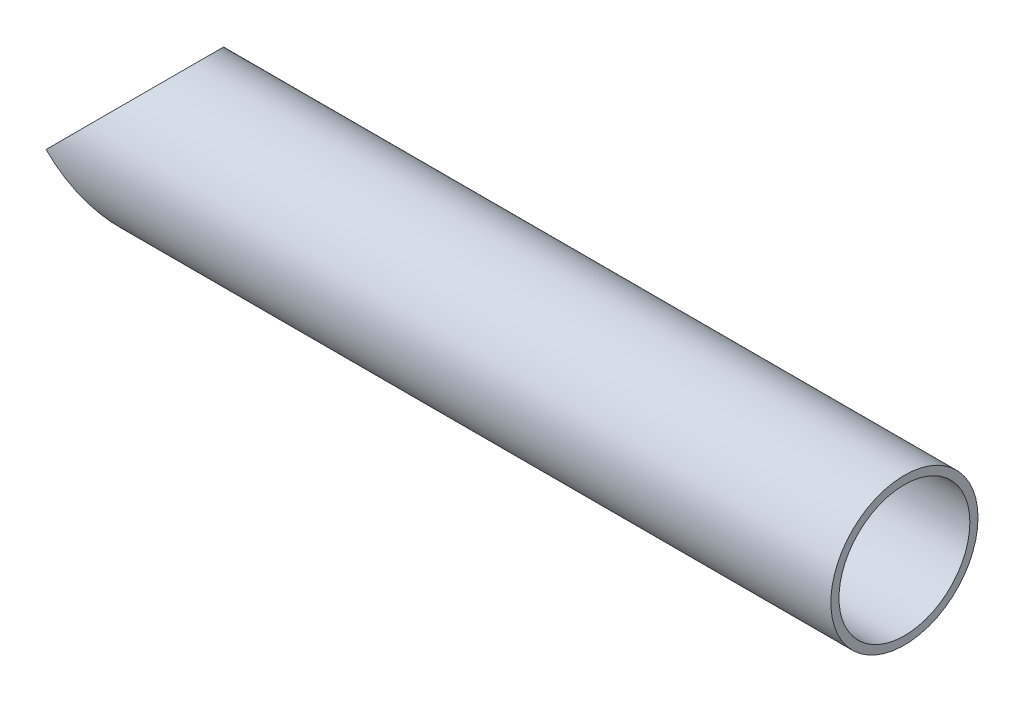
ISO-10303-21;
HEADER;
FILE_DESCRIPTION(('STEP AP214'),'2;1');
FILE_NAME('part.step','',(''),(''),'','','');
FILE_SCHEMA(('AUTOMOTIVE_DESIGN { 1 0 10303 214 1 1 1 1 }'));
ENDSEC;
DATA;
#1=APPLICATION_CONTEXT('core data for automotive mechanical design processes');
#2=APPLICATION_PROTOCOL_DEFINITION('international standard','automotive_design',2000,#1);
#3=PRODUCT_CONTEXT('',#1,'mechanical');
#4=PRODUCT('Part','Part','',(#3));
#5=PRODUCT_RELATED_PRODUCT_CATEGORY('part','',(#4));
#6=PRODUCT_DEFINITION_FORMATION('','',#4);
#7=PRODUCT_DEFINITION_CONTEXT('part definition',#1,'design');
#8=PRODUCT_DEFINITION('design','',#6,#7);
#9=PRODUCT_DEFINITION_SHAPE('','',#8);
#10=(LENGTH_UNIT() NAMED_UNIT(*) SI_UNIT(.MILLI.,.METRE.));
#11=(NAMED_UNIT(*) PLANE_ANGLE_UNIT() SI_UNIT($,.RADIAN.));
#12=(NAMED_UNIT(*) SI_UNIT($,.STERADIAN.) SOLID_ANGLE_UNIT());
#13=UNCERTAINTY_MEASURE_WITH_UNIT(LENGTH_MEASURE(1.E-05),#10,'distance_accuracy_value','');
#14=(GEOMETRIC_REPRESENTATION_CONTEXT(3) GLOBAL_UNCERTAINTY_ASSIGNED_CONTEXT((#13)) GLOBAL_UNIT_ASSIGNED_CONTEXT((#10,
#11,#12)) REPRESENTATION_CONTEXT('',''));
#15=CARTESIAN_POINT('',(0.,0.,0.));
#16=DIRECTION('',(0.,0.,1.));
#17=DIRECTION('',(1.,0.,0.));
#18=AXIS2_PLACEMENT_3D('',#15,#16,#17);
#19=CARTESIAN_POINT('',(0.,0.,0.));
#20=DIRECTION('',(1.,0.,0.));
#21=DIRECTION('',(0.,0.,-1.));
#22=AXIS2_PLACEMENT_3D('',#19,#20,#21);
#23=CYLINDRICAL_SURFACE('',#22,16.9418);
#24=CARTESIAN_POINT('',(203.2,0.,0.));
#25=DIRECTION('',(1.,0.,0.));
#26=DIRECTION('',(0.,0.,-1.));
#27=AXIS2_PLACEMENT_3D('',#24,#25,#26);
#28=CIRCLE('',#27,16.9418);
#29=CARTESIAN_POINT('',(203.2,0.,-16.9418));
#30=VERTEX_POINT('',#29);
#31=EDGE_CURVE('E20',#30,#30,#28,.F.);
#32=ORIENTED_EDGE('',*,*,#31,.F.);
#33=EDGE_LOOP('',(#32));
#34=FACE_BOUND('',#33,.T.);
#35=CARTESIAN_POINT('',(19.05,-16.9418,0.));
#36=CARTESIAN_POINT('',(19.0499962559498,-16.9417961923884,0.394184193497359));
#37=CARTESIAN_POINT('',(19.0377378468611,-16.9280155894072,0.788435535775762));
#38=CARTESIAN_POINT('',(18.9889757880712,-16.8731574498691,1.57356577010718));
#39=CARTESIAN_POINT('',(18.9524665636778,-16.8320736369451,1.96444386579685));
#40=CARTESIAN_POINT('',(18.8559854075676,-16.7233639167852,2.73991152674503));
#41=CARTESIAN_POINT('',(18.7959918911874,-16.6557135918004,3.1244949667674));
#42=CARTESIAN_POINT('',(18.6538337302642,-16.4951203047581,3.88411123711813));
#43=CARTESIAN_POINT('',(18.5716698301213,-16.4021781919052,4.25914438764759));
#44=CARTESIAN_POINT('',(18.3874018477123,-16.1932406328883,4.9948831953637));
#45=CARTESIAN_POINT('',(18.2854307016452,-16.0773987911132,5.35566607021391));
#46=CARTESIAN_POINT('',(18.0630264266601,-15.8239912188579,6.06360117385423));
#47=CARTESIAN_POINT('',(17.9425935399384,-15.6864257733653,6.41075358138511));
#48=CARTESIAN_POINT('',(17.6851657215345,-15.3913086823074,7.09008972801091));
#49=CARTESIAN_POINT('',(17.5481696303309,-15.2337556374548,7.42227241690056));
#50=CARTESIAN_POINT('',(17.2595357581561,-14.9003563184219,8.07074683742289));
#51=CARTESIAN_POINT('',(17.1078947150245,-14.7245059678419,8.38703500458892));
#52=CARTESIAN_POINT('',(16.729782795299,-14.2837373054012,9.12410505100006));
#53=CARTESIAN_POINT('',(16.4973129069134,-14.0109622384892,9.53714057189237));
#54=CARTESIAN_POINT('',(16.0125392563653,-13.4367851491422,10.3304086586787));
#55=CARTESIAN_POINT('',(15.7602282839815,-13.1353727115659,10.7106291933897));
#56=CARTESIAN_POINT('',(15.239902883972,-12.5063214936942,11.4389050770027));
#57=CARTESIAN_POINT('',(14.9718550482439,-12.1786263348985,11.7868876327893));
#58=CARTESIAN_POINT('',(14.4251542372616,-11.499897771744,12.4499819069018));
#59=CARTESIAN_POINT('',(14.1465026723524,-11.1488674664611,12.7650979759111));
#60=CARTESIAN_POINT('',(13.5768058306133,-10.4166191913228,13.3697111612046));
#61=CARTESIAN_POINT('',(13.2856227795236,-10.034898304148,13.6584684285955));
#62=CARTESIAN_POINT('',(12.7023263749846,-9.24882151979435,14.2025527079429));
#63=CARTESIAN_POINT('',(12.4102127745636,-8.84445904128632,14.4578699269681));
#64=CARTESIAN_POINT('',(11.8321599058672,-8.01320927376596,14.9346013590283));
#65=CARTESIAN_POINT('',(11.5462102440835,-7.58636490171245,15.1560772296062));
#66=CARTESIAN_POINT('',(11.1283049959958,-6.92746866843016,15.4626419512512));
#67=CARTESIAN_POINT('',(10.9908654384238,-6.70477675080936,15.5605388024915));
#68=CARTESIAN_POINT('',(10.721095936063,-6.25275448249376,15.7476188132693));
#69=CARTESIAN_POINT('',(10.5887652154918,-6.02342514902508,15.8368032989616));
#70=CARTESIAN_POINT('',(10.3296035058874,-5.5552838813426,16.0070634993151));
#71=CARTESIAN_POINT('',(10.2028435394219,-5.31639841182007,16.088045825461));
#72=CARTESIAN_POINT('',(9.9585439769329,-4.83100990439237,16.2404006796485));
#73=CARTESIAN_POINT('',(9.84100204010332,-4.5845088226869,16.3117756506805));
#74=CARTESIAN_POINT('',(9.61791911037427,-4.08370675821868,16.4442984069774));
#75=CARTESIAN_POINT('',(9.51236667130176,-3.8294135141415,16.5054559733479));
#76=CARTESIAN_POINT('',(9.31637298773715,-3.3127000466186,16.6168712827558));
#77=CARTESIAN_POINT('',(9.22592924446191,-3.05028117557334,16.6671308285956));
#78=CARTESIAN_POINT('',(9.07714600389564,-2.56155126793312,16.7485490492217));
#79=CARTESIAN_POINT('',(9.01597264177484,-2.33640475862084,16.7814899418482));
#80=CARTESIAN_POINT('',(8.90891976158908,-1.88142840856819,16.8385670532647));
#81=CARTESIAN_POINT('',(8.86303555793455,-1.65160002561206,16.8627059697651));
#82=CARTESIAN_POINT('',(8.78857357184005,-1.18876159210724,16.9016346143041));
#83=CARTESIAN_POINT('',(8.75996488294827,-0.955757990655718,16.9164410405595));
#84=CARTESIAN_POINT('',(8.72132440676107,-0.487787683136414,16.9363952490215));
#85=CARTESIAN_POINT('',(8.71129197662944,-0.252821045282682,16.9415433654564));
#86=CARTESIAN_POINT('',(8.71032895345432,0.21781807817749,16.9420385610885));
#87=CARTESIAN_POINT('',(8.71945167193583,0.453490706010544,16.9373582864601));
#88=CARTESIAN_POINT('',(8.75642402893691,0.922946866189685,16.9182729817827));
#89=CARTESIAN_POINT('',(8.78427420924704,1.15673034368411,16.9038676703857));
#90=CARTESIAN_POINT('',(8.8573892619904,1.62115360877383,16.8656705247631));
#91=CARTESIAN_POINT('',(8.90268373200899,1.85178735983585,16.8418627356726));
#92=CARTESIAN_POINT('',(9.00873100058688,2.30839613187296,16.7853765549414));
#93=CARTESIAN_POINT('',(9.06948965101678,2.53436935416423,16.7526948049513));
#94=CARTESIAN_POINT('',(9.23868211218303,3.0949587905454,16.6602122327194));
#95=CARTESIAN_POINT('',(9.35561847205266,3.42613532293257,16.5950848859265));
#96=CARTESIAN_POINT('',(9.61241573066607,4.07550920863552,16.4476704242981));
#97=CARTESIAN_POINT('',(9.75229089591384,4.39369832980286,16.3653726217851));
#98=CARTESIAN_POINT('',(10.0492803058135,5.01855813637698,16.1847084588515));
#99=CARTESIAN_POINT('',(10.2064531387443,5.32518463905188,16.0862869000011));
#100=CARTESIAN_POINT('',(10.5327417683108,5.9265954132761,15.8745609394275));
#101=CARTESIAN_POINT('',(10.7018564662317,6.22138077036862,15.7612579060561));
#102=CARTESIAN_POINT('',(11.0265313309648,6.76368935777249,15.5355128442468));
#103=CARTESIAN_POINT('',(11.1811251827519,7.01249751499682,15.4247509464399));
#104=CARTESIAN_POINT('',(11.494650507006,7.50229328838969,15.1925513006733));
#105=CARTESIAN_POINT('',(11.6535825527517,7.74327986165948,15.0711121369911));
#106=CARTESIAN_POINT('',(12.1345566318495,8.45533714282103,14.6908757746471));
#107=CARTESIAN_POINT('',(12.4606651412086,8.91532399132141,14.4162357153203));
#108=CARTESIAN_POINT('',(13.1133085051984,9.80676129687203,13.8252563067096));
#109=CARTESIAN_POINT('',(13.4398430834094,10.2382252174247,13.5089368452219));
#110=CARTESIAN_POINT('',(14.0856767648303,11.0723963580603,12.8341031687214));
#111=CARTESIAN_POINT('',(14.4049789914448,11.4751161598644,12.4756075990565));
#112=CARTESIAN_POINT('',(14.9705155150666,12.1767333021638,11.7875104078083));
#113=CARTESIAN_POINT('',(15.2191643205568,12.4808781654303,11.4652302076634));
#114=CARTESIAN_POINT('',(15.7036124148581,13.0672425088249,10.7921703362534));
#115=CARTESIAN_POINT('',(15.9394114157986,13.3494614978141,10.4413900269468));
#116=CARTESIAN_POINT('',(16.3940816419322,13.8891714046938,9.71190317795467));
#117=CARTESIAN_POINT('',(16.6129765153373,14.146696994291,9.33323715426065));
#118=CARTESIAN_POINT('',(17.0302785232619,14.6344940609238,8.54807684872153));
#119=CARTESIAN_POINT('',(17.2286910250046,14.8647726801095,8.14158990376791));
#120=CARTESIAN_POINT('',(17.5618178769873,15.2494827529788,7.39030570283799));
#121=CARTESIAN_POINT('',(17.7011548526554,15.4096825772221,7.05050184258111));
#122=CARTESIAN_POINT('',(17.9624513078532,15.7091405581433,6.3553623839508));
#123=CARTESIAN_POINT('',(18.0844145159534,15.8484032084881,6.00003013956722));
#124=CARTESIAN_POINT('',(18.3088159164431,16.1039921676819,5.27573053950244));
#125=CARTESIAN_POINT('',(18.4112778893712,16.2203464179418,4.90678045432037));
#126=CARTESIAN_POINT('',(18.594939692133,16.4285201572901,4.15687556096402));
#127=CARTESIAN_POINT('',(18.6761445789881,16.5203454818711,3.77592363221094));
#128=CARTESIAN_POINT('',(18.7957864030565,16.6554600945729,3.11441535552879));
#129=CARTESIAN_POINT('',(18.8398175906365,16.7051249938061,2.83614726285121));
#130=CARTESIAN_POINT('',(18.9156771391158,16.7906319202838,2.27585994761369));
#131=CARTESIAN_POINT('',(18.9475069345367,16.8264755725,1.99384117005952));
#132=CARTESIAN_POINT('',(18.9985974775901,16.8839855488843,1.42714698383879));
#133=CARTESIAN_POINT('',(19.0178548127459,16.9056480239346,1.14247087515575));
#134=CARTESIAN_POINT('',(19.0435563390206,16.9345554007589,0.571874809772045));
#135=CARTESIAN_POINT('',(19.0500027160656,16.9418027621753,0.285955073616252));
#136=CARTESIAN_POINT('',(19.0499962559498,16.9417961923884,-0.394184193497356));
#137=CARTESIAN_POINT('',(19.0377378468611,16.9280155894072,-0.788435535775759));
#138=CARTESIAN_POINT('',(18.9889757880712,16.8731574498691,-1.57356577010718));
#139=CARTESIAN_POINT('',(18.9524665636778,16.8320736369451,-1.96444386579685));
#140=CARTESIAN_POINT('',(18.8559854075676,16.7233639167852,-2.73991152674503));
#141=CARTESIAN_POINT('',(18.7959918911874,16.6557135918004,-3.1244949667674));
#142=CARTESIAN_POINT('',(18.6538337302642,16.4951203047581,-3.88411123711813));
#143=CARTESIAN_POINT('',(18.5716698301213,16.4021781919052,-4.25914438764759));
#144=CARTESIAN_POINT('',(18.3874018477123,16.1932406328883,-4.9948831953637));
#145=CARTESIAN_POINT('',(18.2854307016452,16.0773987911132,-5.35566607021391));
#146=CARTESIAN_POINT('',(18.0630264266601,15.8239912188579,-6.06360117385423));
#147=CARTESIAN_POINT('',(17.9425935399384,15.6864257733653,-6.41075358138511));
#148=CARTESIAN_POINT('',(17.6851657215345,15.3913086823074,-7.09008972801091));
#149=CARTESIAN_POINT('',(17.5481696303309,15.2337556374548,-7.42227241690056));
#150=CARTESIAN_POINT('',(17.2595357581561,14.9003563184219,-8.07074683742289));
#151=CARTESIAN_POINT('',(17.1078947150245,14.7245059678419,-8.38703500458892));
#152=CARTESIAN_POINT('',(16.729782795299,14.2837373054012,-9.12410505100005));
#153=CARTESIAN_POINT('',(16.4973129069134,14.0109622384892,-9.53714057189236));
#154=CARTESIAN_POINT('',(16.0125392563653,13.4367851491422,-10.3304086586787));
#155=CARTESIAN_POINT('',(15.7602282839815,13.1353727115659,-10.7106291933897));
#156=CARTESIAN_POINT('',(15.239902883972,12.5063214936942,-11.4389050770027));
#157=CARTESIAN_POINT('',(14.9718550482439,12.1786263348985,-11.7868876327893));
#158=CARTESIAN_POINT('',(14.4251542372616,11.499897771744,-12.4499819069018));
#159=CARTESIAN_POINT('',(14.1465026723524,11.1488674664611,-12.7650979759111));
#160=CARTESIAN_POINT('',(13.5768058306133,10.4166191913228,-13.3697111612046));
#161=CARTESIAN_POINT('',(13.2856227795235,10.034898304148,-13.6584684285955));
#162=CARTESIAN_POINT('',(12.7023263749846,9.24882151979434,-14.2025527079429));
#163=CARTESIAN_POINT('',(12.4102127745636,8.84445904128632,-14.4578699269681));
#164=CARTESIAN_POINT('',(11.8321599058672,8.01320927376595,-14.9346013590283));
#165=CARTESIAN_POINT('',(11.5462102440835,7.58636490171244,-15.1560772296062));
#166=CARTESIAN_POINT('',(11.1283049959958,6.92746866843015,-15.4626419512512));
#167=CARTESIAN_POINT('',(10.9908654384238,6.70477675080935,-15.5605388024915));
#168=CARTESIAN_POINT('',(10.721095936063,6.25275448249375,-15.7476188132693));
#169=CARTESIAN_POINT('',(10.5887652154918,6.02342514902507,-15.8368032989616));
#170=CARTESIAN_POINT('',(10.3296035058874,5.5552838813426,-16.0070634993151));
#171=CARTESIAN_POINT('',(10.2028435394219,5.31639841182007,-16.088045825461));
#172=CARTESIAN_POINT('',(9.95854397693291,4.83100990439237,-16.2404006796485));
#173=CARTESIAN_POINT('',(9.84100204010332,4.5845088226869,-16.3117756506805));
#174=CARTESIAN_POINT('',(9.61791911037427,4.08370675821869,-16.4442984069774));
#175=CARTESIAN_POINT('',(9.51236667130176,3.8294135141415,-16.5054559733479));
#176=CARTESIAN_POINT('',(9.31637298773715,3.3127000466186,-16.6168712827558));
#177=CARTESIAN_POINT('',(9.22592924446191,3.05028117557334,-16.6671308285956));
#178=CARTESIAN_POINT('',(9.07714600389564,2.56155126793312,-16.7485490492217));
#179=CARTESIAN_POINT('',(9.01597264177485,2.33640475862084,-16.7814899418482));
#180=CARTESIAN_POINT('',(8.90891976158908,1.88142840856819,-16.8385670532647));
#181=CARTESIAN_POINT('',(8.86303555793454,1.65160002561206,-16.8627059697651));
#182=CARTESIAN_POINT('',(8.78857357184005,1.18876159210724,-16.9016346143041));
#183=CARTESIAN_POINT('',(8.75996488294827,0.955757990655717,-16.9164410405595));
#184=CARTESIAN_POINT('',(8.72132440676107,0.487787683136412,-16.9363952490215));
#185=CARTESIAN_POINT('',(8.71129197662944,0.252821045282681,-16.9415433654564));
#186=CARTESIAN_POINT('',(8.71032895345432,-0.217818078177494,-16.9420385610885));
#187=CARTESIAN_POINT('',(8.71945167193583,-0.45349070601055,-16.9373582864601));
#188=CARTESIAN_POINT('',(8.75642402893691,-0.922946866189692,-16.9182729817827));
#189=CARTESIAN_POINT('',(8.78427420924704,-1.15673034368411,-16.9038676703857));
#190=CARTESIAN_POINT('',(8.8573892619904,-1.62115360877383,-16.8656705247631));
#191=CARTESIAN_POINT('',(8.90268373200899,-1.85178735983585,-16.8418627356726));
#192=CARTESIAN_POINT('',(9.00873100058689,-2.30839613187296,-16.7853765549414));
#193=CARTESIAN_POINT('',(9.06948965101678,-2.53436935416423,-16.7526948049513));
#194=CARTESIAN_POINT('',(9.23868211218303,-3.0949587905454,-16.6602122327194));
#195=CARTESIAN_POINT('',(9.35561847205266,-3.42613532293257,-16.5950848859265));
#196=CARTESIAN_POINT('',(9.61241573066607,-4.07550920863551,-16.4476704242981));
#197=CARTESIAN_POINT('',(9.75229089591383,-4.39369832980286,-16.3653726217851));
#198=CARTESIAN_POINT('',(10.0492803058135,-5.01855813637698,-16.1847084588515));
#199=CARTESIAN_POINT('',(10.2064531387443,-5.32518463905187,-16.0862869000011));
#200=CARTESIAN_POINT('',(10.5327417683108,-5.92659541327609,-15.8745609394275));
#201=CARTESIAN_POINT('',(10.7018564662317,-6.22138077036862,-15.7612579060561));
#202=CARTESIAN_POINT('',(11.0265313309648,-6.76368935777249,-15.5355128442468));
#203=CARTESIAN_POINT('',(11.1811251827518,-7.01249751499681,-15.4247509464399));
#204=CARTESIAN_POINT('',(11.494650507006,-7.50229328838969,-15.1925513006733));
#205=CARTESIAN_POINT('',(11.6535825527517,-7.74327986165947,-15.0711121369911));
#206=CARTESIAN_POINT('',(12.1345566318495,-8.45533714282102,-14.6908757746471));
#207=CARTESIAN_POINT('',(12.4606651412086,-8.9153239913214,-14.4162357153203));
#208=CARTESIAN_POINT('',(13.1133085051984,-9.80676129687201,-13.8252563067096));
#209=CARTESIAN_POINT('',(13.4398430834094,-10.2382252174247,-13.5089368452219));
#210=CARTESIAN_POINT('',(14.0856767648302,-11.0723963580603,-12.8341031687214));
#211=CARTESIAN_POINT('',(14.4049789914447,-11.4751161598644,-12.4756075990565));
#212=CARTESIAN_POINT('',(14.9705155150666,-12.1767333021638,-11.7875104078083));
#213=CARTESIAN_POINT('',(15.2191643205568,-12.4808781654303,-11.4652302076634));
#214=CARTESIAN_POINT('',(15.7036124148581,-13.0672425088249,-10.7921703362534));
#215=CARTESIAN_POINT('',(15.9394114157986,-13.3494614978141,-10.4413900269468));
#216=CARTESIAN_POINT('',(16.3940816419322,-13.8891714046938,-9.71190317795467));
#217=CARTESIAN_POINT('',(16.6129765153373,-14.146696994291,-9.33323715426066));
#218=CARTESIAN_POINT('',(17.0302785232619,-14.6344940609238,-8.54807684872153));
#219=CARTESIAN_POINT('',(17.2286910250046,-14.8647726801095,-8.14158990376791));
#220=CARTESIAN_POINT('',(17.5618178769873,-15.2494827529788,-7.39030570283799));
#221=CARTESIAN_POINT('',(17.7011548526554,-15.4096825772221,-7.05050184258111));
#222=CARTESIAN_POINT('',(17.9624513078532,-15.7091405581433,-6.3553623839508));
#223=CARTESIAN_POINT('',(18.0844145159534,-15.8484032084881,-6.00003013956723));
#224=CARTESIAN_POINT('',(18.3088159164431,-16.1039921676819,-5.27573053950245));
#225=CARTESIAN_POINT('',(18.4112778893712,-16.2203464179418,-4.90678045432037));
#226=CARTESIAN_POINT('',(18.594939692133,-16.4285201572901,-4.15687556096403));
#227=CARTESIAN_POINT('',(18.6761445789881,-16.5203454818711,-3.77592363221095));
#228=CARTESIAN_POINT('',(18.7957864030565,-16.6554600945729,-3.1144153555288));
#229=CARTESIAN_POINT('',(18.8398175906365,-16.7051249938061,-2.83614726285122));
#230=CARTESIAN_POINT('',(18.9156771391158,-16.7906319202838,-2.27585994761369));
#231=CARTESIAN_POINT('',(18.9475069345367,-16.8264755725,-1.99384117005952));
#232=CARTESIAN_POINT('',(18.9985974775901,-16.8839855488843,-1.42714698383878));
#233=CARTESIAN_POINT('',(19.0178548127459,-16.9056480239346,-1.14247087515574));
#234=CARTESIAN_POINT('',(19.0435563390206,-16.9345554007589,-0.571874809772043));
#235=CARTESIAN_POINT('',(19.0500027160656,-16.9418027621753,-0.28595507361625));
#236=CARTESIAN_POINT('',(19.05,-16.9418,0.));
#237=B_SPLINE_CURVE_WITH_KNOTS('',3,(#35,#36,#37,#38,#39,#40,#41,#42,#43,#44,#45,#46,#47,#48,
#49,#50,#51,#52,#53,#54,#55,#56,#57,#58,#59,#60,#61,#62,#63,#64,#65,#66,#67,#68,#69,#70,#71,#72,
#73,#74,#75,#76,#77,#78,#79,#80,#81,#82,#83,#84,#85,#86,#87,#88,#89,#90,#91,#92,#93,#94,#95,#96,
#97,#98,#99,#100,#101,#102,#103,#104,#105,#106,#107,#108,#109,#110,#111,#112,#113,#114,#115,
#116,#117,#118,#119,#120,#121,#122,#123,#124,#125,#126,#127,#128,#129,#130,#131,#132,#133,#134,
#135,#136,#137,#138,#139,#140,#141,#142,#143,#144,#145,#146,#147,#148,#149,#150,#151,#152,#153,
#154,#155,#156,#157,#158,#159,#160,#161,#162,#163,#164,#165,#166,#167,#168,#169,#170,#171,#172,
#173,#174,#175,#176,#177,#178,#179,#180,#181,#182,#183,#184,#185,#186,#187,#188,#189,#190,#191,
#192,#193,#194,#195,#196,#197,#198,#199,#200,#201,#202,#203,#204,#205,#206,#207,#208,#209,#210,
#211,#212,#213,#214,#215,#216,#217,#218,#219,#220,#221,#222,#223,#224,#225,#226,#227,#228,#229,
#230,#231,#232,#233,#234,#235,#236),.UNSPECIFIED.,.T.,.F.,(4,2,2,2,2,2,2,2,2,2,2,2,2,2,2,2,2,2,
2,2,2,2,2,2,2,2,2,2,2,2,2,2,2,2,2,2,2,2,2,2,2,2,2,2,2,2,2,2,2,2,2,2,2,2,2,2,2,2,2,2,2,2,2,2,2,2,
2,2,2,2,2,2,2,2,2,2,2,2,2,2,2,2,2,2,2,2,2,2,2,2,2,2,2,2,2,2,2,2,2,2,4),(0.,1.182242256413,
2.36475637661827,3.54835991978546,4.73192372682959,5.90780261774796,7.08366608382876,
8.25961191496233,9.43582029464446,11.0739682017032,12.7127141850546,14.3550745833379,
15.997217298389,17.6764688085164,19.3562109937498,21.0328552979581,21.8708516620749,
22.7087202709684,23.5552531660917,24.401570393718,25.2470727422877,26.0924351169491,
26.7986824529679,27.5047131495125,28.2094769630755,28.9142163876493,29.6209198025279,
30.3276436634078,31.0355719374648,31.7437685012011,32.8135631624545,33.8840257101523,
34.9582325707478,36.0323407270626,36.9715067853865,37.9107975581714,39.7900551537562,
41.6684192659188,43.5459560833925,45.0690515735914,46.5921811712461,48.1131398453262,
49.6336989485932,50.8346318927197,52.035306716025,53.234507876433,54.4334234892966,
55.2910781673585,56.148631979721,57.006418456737,57.8640585575876,59.0463008140006,
60.2288149342059,61.4124184773731,62.5959822844172,63.7718611753356,64.9477246414164,
66.12367047255,67.2998788522321,68.9380267592909,70.5767727426422,72.2191331409256,
73.8612758559766,75.540527366104,77.2202695513375,78.8969138555458,79.7349102196626,
80.572778828556,81.4193117236794,82.2656289513056,83.1111312998754,83.9564936745367,
84.6627410105555,85.3687717071002,86.0735355206631,86.778274945237,87.4849783601156,
88.1917022209955,88.8996304950525,89.6078270587888,90.6776217200421,91.74808426774,
92.8222911283355,93.8963992846503,94.8355653429742,95.7748561157591,97.6541137113438,
99.5324778235064,101.41001464098,102.933110131179,104.456239728834,105.977198402914,
107.497757506181,108.698690450307,109.899365273613,111.098566434021,112.297482046884,
113.155136724946,114.012690537309,114.870477014325,115.728117115175),.UNSPECIFIED.);
#238=CARTESIAN_POINT('',(19.05,-16.9418,0.));
#239=VERTEX_POINT('',#238);
#240=EDGE_CURVE('E38',#239,#239,#237,.T.);
#241=ORIENTED_EDGE('',*,*,#240,.T.);
#242=EDGE_LOOP('',(#241));
#243=FACE_BOUND('',#242,.T.);
#244=ADVANCED_FACE('F16',(#34,#243),#23,.F.);
#245=CARTESIAN_POINT('',(203.2,0.,0.));
#246=DIRECTION('',(1.,0.,0.));
#247=DIRECTION('',(0.,0.,-1.));
#248=AXIS2_PLACEMENT_3D('',#245,#246,#247);
#249=PLANE('',#248);
#250=ORIENTED_EDGE('',*,*,#31,.T.);
#251=EDGE_LOOP('',(#250));
#252=FACE_BOUND('',#251,.T.);
#253=CARTESIAN_POINT('',(203.2,0.,0.));
#254=DIRECTION('',(1.,0.,0.));
#255=DIRECTION('',(0.,0.,-1.));
#256=AXIS2_PLACEMENT_3D('',#253,#254,#255);
#257=CIRCLE('',#256,19.05);
#258=CARTESIAN_POINT('',(203.2,0.,-19.05));
#259=VERTEX_POINT('',#258);
#260=EDGE_CURVE('E35',#259,#259,#257,.F.);
#261=ORIENTED_EDGE('',*,*,#260,.F.);
#262=EDGE_LOOP('',(#261));
#263=FACE_BOUND('',#262,.T.);
#264=ADVANCED_FACE('F47',(#252,#263),#249,.T.);
#265=CARTESIAN_POINT('',(0.,-20.2057,0.));
#266=DIRECTION('',(0.,1.,0.));
#267=DIRECTION('',(0.,0.,1.));
#268=AXIS2_PLACEMENT_3D('',#265,#266,#267);
#269=CYLINDRICAL_SURFACE('',#268,19.05);
#270=ORIENTED_EDGE('',*,*,#240,.F.);
#271=EDGE_LOOP('',(#270));
#272=FACE_BOUND('',#271,.T.);
#273=CARTESIAN_POINT('',(0.,0.,0.));
#274=DIRECTION('',(0.707106781186547,0.707106781186547,0.));
#275=DIRECTION('',(-0.707106781186547,0.707106781186547,0.));
#276=AXIS2_PLACEMENT_3D('',#273,#274,#275);
#277=ELLIPSE('',#276,26.9407683632075,19.05);
#278=CARTESIAN_POINT('',(0.,0.,19.05));
#279=VERTEX_POINT('',#278);
#280=CARTESIAN_POINT('',(0.,0.,-19.05));
#281=VERTEX_POINT('',#280);
#282=EDGE_CURVE('E11',#279,#281,#277,.T.);
#283=ORIENTED_EDGE('',*,*,#282,.F.);
#284=CARTESIAN_POINT('',(0.,0.,0.));
#285=DIRECTION('',(-0.707106781186547,0.707106781186547,0.));
#286=DIRECTION('',(0.707106781186547,0.707106781186547,0.));
#287=AXIS2_PLACEMENT_3D('',#284,#285,#286);
#288=ELLIPSE('',#287,26.9407683632075,19.05);
#289=EDGE_CURVE('E26',#281,#279,#288,.F.);
#290=ORIENTED_EDGE('',*,*,#289,.F.);
#291=EDGE_LOOP('',(#283,#290));
#292=FACE_BOUND('',#291,.T.);
#293=ADVANCED_FACE('F34',(#272,#292),#269,.F.);
#294=CARTESIAN_POINT('',(0.,0.,0.));
#295=DIRECTION('',(1.,0.,0.));
#296=DIRECTION('',(0.,0.,-1.));
#297=AXIS2_PLACEMENT_3D('',#294,#295,#296);
#298=CYLINDRICAL_SURFACE('',#297,19.05);
#299=ORIENTED_EDGE('',*,*,#260,.T.);
#300=EDGE_LOOP('',(#299));
#301=FACE_BOUND('',#300,.T.);
#302=ORIENTED_EDGE('',*,*,#289,.T.);
#303=ORIENTED_EDGE('',*,*,#282,.T.);
#304=EDGE_LOOP('',(#302,#303));
#305=FACE_BOUND('',#304,.T.);
#306=ADVANCED_FACE('F33',(#301,#305),#298,.T.);
#307=CLOSED_SHELL('',(#244,#264,#293,#306));
#308=MANIFOLD_SOLID_BREP('B1',#307);
#309=ADVANCED_BREP_SHAPE_REPRESENTATION('',(#18,#308),#14);
#310=SHAPE_DEFINITION_REPRESENTATION(#9,#309);
ENDSEC;
END-ISO-10303-21;
